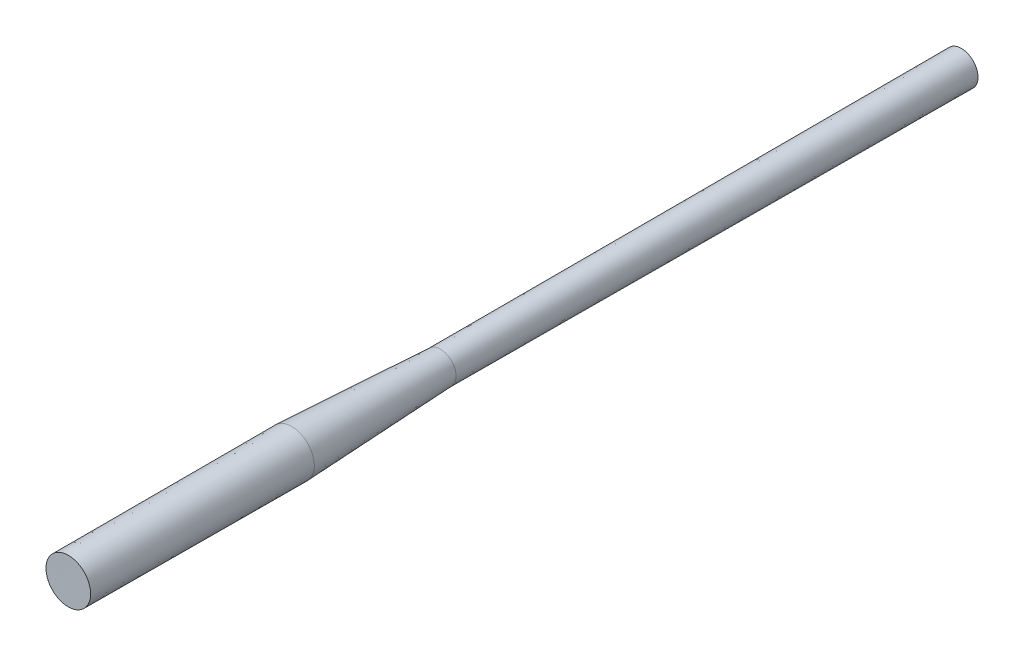
ISO-10303-21;
HEADER;
FILE_DESCRIPTION(('STEP AP214'),'2;1');
FILE_NAME('part.step','',(''),(''),'','','');
FILE_SCHEMA(('AUTOMOTIVE_DESIGN { 1 0 10303 214 1 1 1 1 }'));
ENDSEC;
DATA;
#1=APPLICATION_CONTEXT('core data for automotive mechanical design processes');
#2=APPLICATION_PROTOCOL_DEFINITION('international standard','automotive_design',2000,#1);
#3=PRODUCT_CONTEXT('',#1,'mechanical');
#4=PRODUCT('Part','Part','',(#3));
#5=PRODUCT_RELATED_PRODUCT_CATEGORY('part','',(#4));
#6=PRODUCT_DEFINITION_FORMATION('','',#4);
#7=PRODUCT_DEFINITION_CONTEXT('part definition',#1,'design');
#8=PRODUCT_DEFINITION('design','',#6,#7);
#9=PRODUCT_DEFINITION_SHAPE('','',#8);
#10=(LENGTH_UNIT() NAMED_UNIT(*) SI_UNIT(.MILLI.,.METRE.));
#11=(NAMED_UNIT(*) PLANE_ANGLE_UNIT() SI_UNIT($,.RADIAN.));
#12=(NAMED_UNIT(*) SI_UNIT($,.STERADIAN.) SOLID_ANGLE_UNIT());
#13=UNCERTAINTY_MEASURE_WITH_UNIT(LENGTH_MEASURE(1.E-05),#10,'distance_accuracy_value','');
#14=(GEOMETRIC_REPRESENTATION_CONTEXT(3) GLOBAL_UNCERTAINTY_ASSIGNED_CONTEXT((#13)) GLOBAL_UNIT_ASSIGNED_CONTEXT((#10,
#11,#12)) REPRESENTATION_CONTEXT('',''));
#15=CARTESIAN_POINT('',(0.,0.,0.));
#16=DIRECTION('',(0.,0.,1.));
#17=DIRECTION('',(1.,0.,0.));
#18=AXIS2_PLACEMENT_3D('',#15,#16,#17);
#19=CARTESIAN_POINT('',(0.,0.000323829286827488,0.157084966788193));
#20=DIRECTION('',(0.,0.00206148688416615,0.999997875133656));
#21=DIRECTION('',(0.,-0.999997875133656,0.00206148688416615));
#22=AXIS2_PLACEMENT_3D('',#19,#20,#21);
#23=CONICAL_SURFACE('',#22,76.1998380851846,1.5687348384506);
#24=CARTESIAN_POINT('',(0.,0.,0.));
#25=VERTEX_POINT('',#24);
#26=VERTEX_LOOP('',#25);
#27=FACE_BOUND('',#26,.T.);
#28=CARTESIAN_POINT('',(0.,0.000323829286827488,0.157084966788193));
#29=DIRECTION('',(0.,0.00206148688416615,0.999997875133656));
#30=DIRECTION('',(0.,-0.999997875133656,0.00206148688416615));
#31=AXIS2_PLACEMENT_3D('',#28,#29,#30);
#32=CIRCLE('',#31,76.1998380851846);
#33=CARTESIAN_POINT('',(0.,-76.1993523414264,0.314169933576385));
#34=VERTEX_POINT('',#33);
#35=EDGE_CURVE('E54',#34,#34,#32,.T.);
#36=ORIENTED_EDGE('',*,*,#35,.T.);
#37=EDGE_LOOP('',(#36));
#38=FACE_BOUND('',#37,.T.);
#39=ADVANCED_FACE('F36',(#27,#38),#23,.F.);
#40=CARTESIAN_POINT('',(0.,-6.28342537437754,-3048.));
#41=DIRECTION('',(0.,0.00206148688416615,0.999997875133656));
#42=DIRECTION('',(0.,-0.999997875133656,0.00206148688416615));
#43=AXIS2_PLACEMENT_3D('',#40,#41,#42);
#44=CONICAL_SURFACE('',#43,4.44092597968927E-13,1.56873483845061);
#45=CARTESIAN_POINT('',(0.,-6.28318278533648,-3047.88232351734));
#46=DIRECTION('',(0.,0.00206148688416615,0.999997875133656));
#47=DIRECTION('',(0.,-0.999997875133656,0.00206148688416615));
#48=AXIS2_PLACEMENT_3D('',#45,#46,#47);
#49=CIRCLE('',#48,57.0833040797281);
#50=CARTESIAN_POINT('',(0.,-63.366365570673,-3047.76464703467));
#51=VERTEX_POINT('',#50);
#52=EDGE_CURVE('E11',#51,#51,#49,.T.);
#53=ORIENTED_EDGE('',*,*,#52,.F.);
#54=EDGE_LOOP('',(#53));
#55=FACE_BOUND('',#54,.T.);
#56=CARTESIAN_POINT('',(0.,-6.28342537437754,-3048.));
#57=VERTEX_POINT('',#56);
#58=VERTEX_LOOP('',#57);
#59=FACE_BOUND('',#58,.T.);
#60=ADVANCED_FACE('F51',(#55,#59),#44,.T.);
#61=CARTESIAN_POINT('',(0.,-6.28318278533648,-3047.88232351734));
#62=DIRECTION('',(0.,-0.00206148688416615,-0.999997875133656));
#63=DIRECTION('',(0.,0.999997875133656,-0.00206148688416615));
#64=AXIS2_PLACEMENT_3D('',#61,#62,#63);
#65=CONICAL_SURFACE('',#64,57.0833040797281,0.00206148834429543);
#66=CARTESIAN_POINT('',(0.,-2.61786689361199,-1269.88987953403));
#67=DIRECTION('',(0.,0.00206148688416615,0.999997875133656));
#68=DIRECTION('',(0.,-0.999997875133656,0.00206148688416615));
#69=AXIS2_PLACEMENT_3D('',#66,#67,#68);
#70=CIRCLE('',#69,53.4179803996807);
#71=CARTESIAN_POINT('',(0.,-56.035733787224,-1269.77975906805));
#72=VERTEX_POINT('',#71);
#73=EDGE_CURVE('E43',#72,#72,#70,.T.);
#74=ORIENTED_EDGE('',*,*,#73,.F.);
#75=EDGE_LOOP('',(#74));
#76=FACE_BOUND('',#75,.T.);
#77=ORIENTED_EDGE('',*,*,#52,.T.);
#78=EDGE_LOOP('',(#77));
#79=FACE_BOUND('',#78,.T.);
#80=ADVANCED_FACE('F65',(#76,#79),#65,.T.);
#81=CARTESIAN_POINT('',(0.,-2.61786689361199,-1269.88987953403));
#82=DIRECTION('',(0.,0.00206148688416615,0.999997875133656));
#83=DIRECTION('',(0.,-0.999997875133656,0.00206148688416615));
#84=AXIS2_PLACEMENT_3D('',#81,#82,#83);
#85=CONICAL_SURFACE('',#84,53.4179803996807,0.0478969073776474);
#86=CARTESIAN_POINT('',(0.,-1.5705258385951,-761.839676740344));
#87=DIRECTION('',(0.,0.00206148688416615,0.999997875133656));
#88=DIRECTION('',(0.,-0.999997875133656,0.00206148688416615));
#89=AXIS2_PLACEMENT_3D('',#86,#87,#88);
#90=CIRCLE('',#89,77.7706910909192);
#91=CARTESIAN_POINT('',(0.,-79.3410516771902,-761.679353480687));
#92=VERTEX_POINT('',#91);
#93=EDGE_CURVE('E56',#92,#92,#90,.T.);
#94=ORIENTED_EDGE('',*,*,#93,.F.);
#95=EDGE_LOOP('',(#94));
#96=FACE_BOUND('',#95,.T.);
#97=ORIENTED_EDGE('',*,*,#73,.T.);
#98=EDGE_LOOP('',(#97));
#99=FACE_BOUND('',#98,.T.);
#100=ADVANCED_FACE('F63',(#96,#99),#85,.T.);
#101=CARTESIAN_POINT('',(0.,-1.5705258385951,-761.839676740344));
#102=DIRECTION('',(0.,-0.00206148688416615,-0.999997875133656));
#103=DIRECTION('',(0.,0.999997875133656,-0.00206148688416615));
#104=AXIS2_PLACEMENT_3D('',#101,#102,#103);
#105=CONICAL_SURFACE('',#104,77.7706910909192,0.00206148834429544);
#106=ORIENTED_EDGE('',*,*,#35,.F.);
#107=EDGE_LOOP('',(#106));
#108=FACE_BOUND('',#107,.T.);
#109=ORIENTED_EDGE('',*,*,#93,.T.);
#110=EDGE_LOOP('',(#109));
#111=FACE_BOUND('',#110,.T.);
#112=ADVANCED_FACE('F77',(#108,#111),#105,.T.);
#113=CLOSED_SHELL('',(#39,#60,#80,#100,#112));
#114=MANIFOLD_SOLID_BREP('B2',#113);
#115=ADVANCED_BREP_SHAPE_REPRESENTATION('',(#18,#114),#14);
#116=SHAPE_DEFINITION_REPRESENTATION(#9,#115);
ENDSEC;
END-ISO-10303-21;
